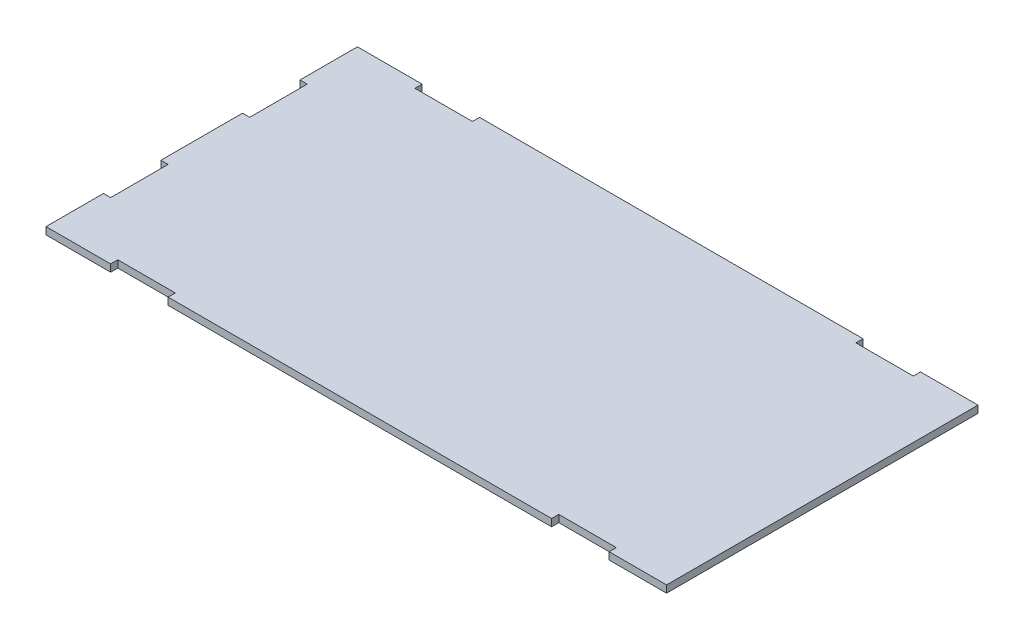
ISO-10303-21;
HEADER;
FILE_DESCRIPTION(('STEP AP214'),'2;1');
FILE_NAME('part.step','',(''),(''),'','','');
FILE_SCHEMA(('AUTOMOTIVE_DESIGN { 1 0 10303 214 1 1 1 1 }'));
ENDSEC;
DATA;
#1=APPLICATION_CONTEXT('core data for automotive mechanical design processes');
#2=APPLICATION_PROTOCOL_DEFINITION('international standard','automotive_design',2000,#1);
#3=PRODUCT_CONTEXT('',#1,'mechanical');
#4=PRODUCT('Part','Part','',(#3));
#5=PRODUCT_RELATED_PRODUCT_CATEGORY('part','',(#4));
#6=PRODUCT_DEFINITION_FORMATION('','',#4);
#7=PRODUCT_DEFINITION_CONTEXT('part definition',#1,'design');
#8=PRODUCT_DEFINITION('design','',#6,#7);
#9=PRODUCT_DEFINITION_SHAPE('','',#8);
#10=(LENGTH_UNIT() NAMED_UNIT(*) SI_UNIT(.MILLI.,.METRE.));
#11=(NAMED_UNIT(*) PLANE_ANGLE_UNIT() SI_UNIT($,.RADIAN.));
#12=(NAMED_UNIT(*) SI_UNIT($,.STERADIAN.) SOLID_ANGLE_UNIT());
#13=UNCERTAINTY_MEASURE_WITH_UNIT(LENGTH_MEASURE(1.E-05),#10,'distance_accuracy_value','');
#14=(GEOMETRIC_REPRESENTATION_CONTEXT(3) GLOBAL_UNCERTAINTY_ASSIGNED_CONTEXT((#13)) GLOBAL_UNIT_ASSIGNED_CONTEXT((#10,
#11,#12)) REPRESENTATION_CONTEXT('',''));
#15=CARTESIAN_POINT('',(0.,0.,0.));
#16=DIRECTION('',(0.,0.,1.));
#17=DIRECTION('',(1.,0.,0.));
#18=AXIS2_PLACEMENT_3D('',#15,#16,#17);
#19=CARTESIAN_POINT('',(-137.16,3.175,-68.834));
#20=DIRECTION('',(1.,0.,0.));
#21=DIRECTION('',(0.,0.,-1.));
#22=AXIS2_PLACEMENT_3D('',#19,#20,#21);
#23=PLANE('',#22);
#24=DIRECTION('',(0.,0.,1.));
#25=VECTOR('',#24,1.);
#26=CARTESIAN_POINT('',(-137.16,0.,-68.834));
#27=LINE('',#26,#25);
#28=CARTESIAN_POINT('',(-137.16,0.,-68.834));
#29=VERTEX_POINT('',#28);
#30=CARTESIAN_POINT('',(-137.16,0.,-43.434));
#31=VERTEX_POINT('',#30);
#32=EDGE_CURVE('E249',#29,#31,#27,.T.);
#33=ORIENTED_EDGE('',*,*,#32,.T.);
#34=DIRECTION('',(0.,-1.,0.));
#35=VECTOR('',#34,1.);
#36=CARTESIAN_POINT('',(-137.16,3.175,-43.434));
#37=LINE('',#36,#35);
#38=CARTESIAN_POINT('',(-137.16,3.175,-43.434));
#39=VERTEX_POINT('',#38);
#40=EDGE_CURVE('E11',#39,#31,#37,.T.);
#41=ORIENTED_EDGE('',*,*,#40,.F.);
#42=DIRECTION('',(0.,0.,1.));
#43=VECTOR('',#42,1.);
#44=CARTESIAN_POINT('',(-137.16,3.175,-68.834));
#45=LINE('',#44,#43);
#46=CARTESIAN_POINT('',(-137.16,3.175,-68.834));
#47=VERTEX_POINT('',#46);
#48=EDGE_CURVE('E303',#47,#39,#45,.T.);
#49=ORIENTED_EDGE('',*,*,#48,.F.);
#50=DIRECTION('',(0.,-1.,0.));
#51=VECTOR('',#50,1.);
#52=CARTESIAN_POINT('',(-137.16,3.175,-68.834));
#53=LINE('',#52,#51);
#54=EDGE_CURVE('E245',#47,#29,#53,.T.);
#55=ORIENTED_EDGE('',*,*,#54,.T.);
#56=EDGE_LOOP('',(#33,#41,#49,#55));
#57=FACE_BOUND('',#56,.T.);
#58=ADVANCED_FACE('F33',(#57),#23,.F.);
#59=CARTESIAN_POINT('',(-137.16,3.175,-43.434));
#60=DIRECTION('',(0.,0.,-1.));
#61=DIRECTION('',(-1.,0.,0.));
#62=AXIS2_PLACEMENT_3D('',#59,#60,#61);
#63=PLANE('',#62);
#64=DIRECTION('',(1.,0.,0.));
#65=VECTOR('',#64,1.);
#66=CARTESIAN_POINT('',(-137.16,0.,-43.434));
#67=LINE('',#66,#65);
#68=CARTESIAN_POINT('',(-133.985,0.,-43.434));
#69=VERTEX_POINT('',#68);
#70=EDGE_CURVE('E252',#31,#69,#67,.T.);
#71=ORIENTED_EDGE('',*,*,#70,.T.);
#72=DIRECTION('',(0.,-1.,0.));
#73=VECTOR('',#72,1.);
#74=CARTESIAN_POINT('',(-133.985,3.175,-43.434));
#75=LINE('',#74,#73);
#76=CARTESIAN_POINT('',(-133.985,3.175,-43.434));
#77=VERTEX_POINT('',#76);
#78=EDGE_CURVE('E41',#77,#69,#75,.T.);
#79=ORIENTED_EDGE('',*,*,#78,.F.);
#80=DIRECTION('',(1.,0.,0.));
#81=VECTOR('',#80,1.);
#82=CARTESIAN_POINT('',(-137.16,3.175,-43.434));
#83=LINE('',#82,#81);
#84=EDGE_CURVE('E152',#39,#77,#83,.T.);
#85=ORIENTED_EDGE('',*,*,#84,.F.);
#86=ORIENTED_EDGE('',*,*,#40,.T.);
#87=EDGE_LOOP('',(#71,#79,#85,#86));
#88=FACE_BOUND('',#87,.T.);
#89=ADVANCED_FACE('F461',(#88),#63,.F.);
#90=CARTESIAN_POINT('',(-133.985,3.175,-43.434));
#91=DIRECTION('',(1.,0.,0.));
#92=DIRECTION('',(0.,0.,-1.));
#93=AXIS2_PLACEMENT_3D('',#90,#91,#92);
#94=PLANE('',#93);
#95=DIRECTION('',(0.,0.,1.));
#96=VECTOR('',#95,1.);
#97=CARTESIAN_POINT('',(-133.985,0.,-43.434));
#98=LINE('',#97,#96);
#99=CARTESIAN_POINT('',(-133.985,0.,-18.034));
#100=VERTEX_POINT('',#99);
#101=EDGE_CURVE('E254',#69,#100,#98,.T.);
#102=ORIENTED_EDGE('',*,*,#101,.T.);
#103=DIRECTION('',(0.,-1.,0.));
#104=VECTOR('',#103,1.);
#105=CARTESIAN_POINT('',(-133.985,3.175,-18.034));
#106=LINE('',#105,#104);
#107=CARTESIAN_POINT('',(-133.985,3.175,-18.034));
#108=VERTEX_POINT('',#107);
#109=EDGE_CURVE('E370',#108,#100,#106,.T.);
#110=ORIENTED_EDGE('',*,*,#109,.F.);
#111=DIRECTION('',(0.,0.,1.));
#112=VECTOR('',#111,1.);
#113=CARTESIAN_POINT('',(-133.985,3.175,-43.434));
#114=LINE('',#113,#112);
#115=EDGE_CURVE('E378',#77,#108,#114,.T.);
#116=ORIENTED_EDGE('',*,*,#115,.F.);
#117=ORIENTED_EDGE('',*,*,#78,.T.);
#118=EDGE_LOOP('',(#102,#110,#116,#117));
#119=FACE_BOUND('',#118,.T.);
#120=ADVANCED_FACE('F376',(#119),#94,.F.);
#121=CARTESIAN_POINT('',(-133.985,3.175,-18.034));
#122=DIRECTION('',(0.,0.,1.));
#123=DIRECTION('',(1.,0.,0.));
#124=AXIS2_PLACEMENT_3D('',#121,#122,#123);
#125=PLANE('',#124);
#126=DIRECTION('',(-1.,0.,0.));
#127=VECTOR('',#126,1.);
#128=CARTESIAN_POINT('',(-133.985,0.,-18.034));
#129=LINE('',#128,#127);
#130=CARTESIAN_POINT('',(-137.16,0.,-18.034));
#131=VERTEX_POINT('',#130);
#132=EDGE_CURVE('E256',#100,#131,#129,.T.);
#133=ORIENTED_EDGE('',*,*,#132,.T.);
#134=DIRECTION('',(0.,-1.,0.));
#135=VECTOR('',#134,1.);
#136=CARTESIAN_POINT('',(-137.16,3.175,-18.034));
#137=LINE('',#136,#135);
#138=CARTESIAN_POINT('',(-137.16,3.175,-18.034));
#139=VERTEX_POINT('',#138);
#140=EDGE_CURVE('E367',#139,#131,#137,.T.);
#141=ORIENTED_EDGE('',*,*,#140,.F.);
#142=DIRECTION('',(-1.,0.,0.));
#143=VECTOR('',#142,1.);
#144=CARTESIAN_POINT('',(-133.985,3.175,-18.034));
#145=LINE('',#144,#143);
#146=EDGE_CURVE('E396',#108,#139,#145,.T.);
#147=ORIENTED_EDGE('',*,*,#146,.F.);
#148=ORIENTED_EDGE('',*,*,#109,.T.);
#149=EDGE_LOOP('',(#133,#141,#147,#148));
#150=FACE_BOUND('',#149,.T.);
#151=ADVANCED_FACE('F387',(#150),#125,.F.);
#152=CARTESIAN_POINT('',(-137.16,3.175,-18.034));
#153=DIRECTION('',(1.,0.,0.));
#154=DIRECTION('',(0.,0.,-1.));
#155=AXIS2_PLACEMENT_3D('',#152,#153,#154);
#156=PLANE('',#155);
#157=DIRECTION('',(0.,0.,1.));
#158=VECTOR('',#157,1.);
#159=CARTESIAN_POINT('',(-137.16,0.,-18.034));
#160=LINE('',#159,#158);
#161=CARTESIAN_POINT('',(-137.16,0.,18.034));
#162=VERTEX_POINT('',#161);
#163=EDGE_CURVE('E258',#131,#162,#160,.T.);
#164=ORIENTED_EDGE('',*,*,#163,.T.);
#165=DIRECTION('',(0.,-1.,0.));
#166=VECTOR('',#165,1.);
#167=CARTESIAN_POINT('',(-137.16,3.175,18.034));
#168=LINE('',#167,#166);
#169=CARTESIAN_POINT('',(-137.16,3.175,18.034));
#170=VERTEX_POINT('',#169);
#171=EDGE_CURVE('E364',#170,#162,#168,.T.);
#172=ORIENTED_EDGE('',*,*,#171,.F.);
#173=DIRECTION('',(0.,0.,1.));
#174=VECTOR('',#173,1.);
#175=CARTESIAN_POINT('',(-137.16,3.175,-18.034));
#176=LINE('',#175,#174);
#177=EDGE_CURVE('E393',#139,#170,#176,.T.);
#178=ORIENTED_EDGE('',*,*,#177,.F.);
#179=ORIENTED_EDGE('',*,*,#140,.T.);
#180=EDGE_LOOP('',(#164,#172,#178,#179));
#181=FACE_BOUND('',#180,.T.);
#182=ADVANCED_FACE('F391',(#181),#156,.F.);
#183=CARTESIAN_POINT('',(-133.985,3.175,18.034));
#184=DIRECTION('',(0.,0.,-1.));
#185=DIRECTION('',(-1.,0.,0.));
#186=AXIS2_PLACEMENT_3D('',#183,#184,#185);
#187=PLANE('',#186);
#188=DIRECTION('',(1.,0.,0.));
#189=VECTOR('',#188,1.);
#190=CARTESIAN_POINT('',(-133.985,0.,18.034));
#191=LINE('',#190,#189);
#192=CARTESIAN_POINT('',(-133.985,0.,18.034));
#193=VERTEX_POINT('',#192);
#194=EDGE_CURVE('E260',#162,#193,#191,.T.);
#195=ORIENTED_EDGE('',*,*,#194,.T.);
#196=DIRECTION('',(0.,-1.,0.));
#197=VECTOR('',#196,1.);
#198=CARTESIAN_POINT('',(-133.985,3.175,18.034));
#199=LINE('',#198,#197);
#200=CARTESIAN_POINT('',(-133.985,3.175,18.034));
#201=VERTEX_POINT('',#200);
#202=EDGE_CURVE('E361',#201,#193,#199,.T.);
#203=ORIENTED_EDGE('',*,*,#202,.F.);
#204=DIRECTION('',(1.,0.,0.));
#205=VECTOR('',#204,1.);
#206=CARTESIAN_POINT('',(-133.985,3.175,18.034));
#207=LINE('',#206,#205);
#208=EDGE_CURVE('E395',#170,#201,#207,.T.);
#209=ORIENTED_EDGE('',*,*,#208,.F.);
#210=ORIENTED_EDGE('',*,*,#171,.T.);
#211=EDGE_LOOP('',(#195,#203,#209,#210));
#212=FACE_BOUND('',#211,.T.);
#213=ADVANCED_FACE('F474',(#212),#187,.F.);
#214=CARTESIAN_POINT('',(-133.985,3.175,43.434));
#215=DIRECTION('',(1.,0.,0.));
#216=DIRECTION('',(0.,0.,-1.));
#217=AXIS2_PLACEMENT_3D('',#214,#215,#216);
#218=PLANE('',#217);
#219=DIRECTION('',(0.,0.,1.));
#220=VECTOR('',#219,1.);
#221=CARTESIAN_POINT('',(-133.985,0.,43.434));
#222=LINE('',#221,#220);
#223=CARTESIAN_POINT('',(-133.985,0.,43.434));
#224=VERTEX_POINT('',#223);
#225=EDGE_CURVE('E262',#193,#224,#222,.T.);
#226=ORIENTED_EDGE('',*,*,#225,.T.);
#227=DIRECTION('',(0.,-1.,0.));
#228=VECTOR('',#227,1.);
#229=CARTESIAN_POINT('',(-133.985,3.175,43.434));
#230=LINE('',#229,#228);
#231=CARTESIAN_POINT('',(-133.985,3.175,43.434));
#232=VERTEX_POINT('',#231);
#233=EDGE_CURVE('E358',#232,#224,#230,.T.);
#234=ORIENTED_EDGE('',*,*,#233,.F.);
#235=DIRECTION('',(0.,0.,1.));
#236=VECTOR('',#235,1.);
#237=CARTESIAN_POINT('',(-133.985,3.175,43.434));
#238=LINE('',#237,#236);
#239=EDGE_CURVE('E398',#201,#232,#238,.T.);
#240=ORIENTED_EDGE('',*,*,#239,.F.);
#241=ORIENTED_EDGE('',*,*,#202,.T.);
#242=EDGE_LOOP('',(#226,#234,#240,#241));
#243=FACE_BOUND('',#242,.T.);
#244=ADVANCED_FACE('F477',(#243),#218,.F.);
#245=CARTESIAN_POINT('',(-137.16,3.175,43.434));
#246=DIRECTION('',(0.,0.,1.));
#247=DIRECTION('',(1.,0.,0.));
#248=AXIS2_PLACEMENT_3D('',#245,#246,#247);
#249=PLANE('',#248);
#250=DIRECTION('',(-1.,0.,0.));
#251=VECTOR('',#250,1.);
#252=CARTESIAN_POINT('',(-137.16,0.,43.434));
#253=LINE('',#252,#251);
#254=CARTESIAN_POINT('',(-137.16,0.,43.434));
#255=VERTEX_POINT('',#254);
#256=EDGE_CURVE('E264',#224,#255,#253,.T.);
#257=ORIENTED_EDGE('',*,*,#256,.T.);
#258=DIRECTION('',(0.,-1.,0.));
#259=VECTOR('',#258,1.);
#260=CARTESIAN_POINT('',(-137.16,3.175,43.434));
#261=LINE('',#260,#259);
#262=CARTESIAN_POINT('',(-137.16,3.175,43.434));
#263=VERTEX_POINT('',#262);
#264=EDGE_CURVE('E355',#263,#255,#261,.T.);
#265=ORIENTED_EDGE('',*,*,#264,.F.);
#266=DIRECTION('',(-1.,0.,0.));
#267=VECTOR('',#266,1.);
#268=CARTESIAN_POINT('',(-137.16,3.175,43.434));
#269=LINE('',#268,#267);
#270=EDGE_CURVE('E404',#232,#263,#269,.T.);
#271=ORIENTED_EDGE('',*,*,#270,.F.);
#272=ORIENTED_EDGE('',*,*,#233,.T.);
#273=EDGE_LOOP('',(#257,#265,#271,#272));
#274=FACE_BOUND('',#273,.T.);
#275=ADVANCED_FACE('F481',(#274),#249,.F.);
#276=CARTESIAN_POINT('',(-137.16,3.175,43.434));
#277=DIRECTION('',(1.,0.,0.));
#278=DIRECTION('',(0.,0.,-1.));
#279=AXIS2_PLACEMENT_3D('',#276,#277,#278);
#280=PLANE('',#279);
#281=DIRECTION('',(0.,0.,1.));
#282=VECTOR('',#281,1.);
#283=CARTESIAN_POINT('',(-137.16,0.,43.434));
#284=LINE('',#283,#282);
#285=CARTESIAN_POINT('',(-137.16,0.,68.834));
#286=VERTEX_POINT('',#285);
#287=EDGE_CURVE('E266',#255,#286,#284,.T.);
#288=ORIENTED_EDGE('',*,*,#287,.T.);
#289=DIRECTION('',(0.,-1.,0.));
#290=VECTOR('',#289,1.);
#291=CARTESIAN_POINT('',(-137.16,3.175,68.834));
#292=LINE('',#291,#290);
#293=CARTESIAN_POINT('',(-137.16,3.175,68.834));
#294=VERTEX_POINT('',#293);
#295=EDGE_CURVE('E352',#294,#286,#292,.T.);
#296=ORIENTED_EDGE('',*,*,#295,.F.);
#297=DIRECTION('',(0.,0.,1.));
#298=VECTOR('',#297,1.);
#299=CARTESIAN_POINT('',(-137.16,3.175,43.434));
#300=LINE('',#299,#298);
#301=EDGE_CURVE('E406',#263,#294,#300,.T.);
#302=ORIENTED_EDGE('',*,*,#301,.F.);
#303=ORIENTED_EDGE('',*,*,#264,.T.);
#304=EDGE_LOOP('',(#288,#296,#302,#303));
#305=FACE_BOUND('',#304,.T.);
#306=ADVANCED_FACE('F485',(#305),#280,.F.);
#307=CARTESIAN_POINT('',(-137.16,3.175,68.834));
#308=DIRECTION('',(0.,0.,-1.));
#309=DIRECTION('',(-1.,0.,0.));
#310=AXIS2_PLACEMENT_3D('',#307,#308,#309);
#311=PLANE('',#310);
#312=DIRECTION('',(1.,0.,0.));
#313=VECTOR('',#312,1.);
#314=CARTESIAN_POINT('',(-137.16,0.,68.834));
#315=LINE('',#314,#313);
#316=CARTESIAN_POINT('',(-108.585,0.,68.834));
#317=VERTEX_POINT('',#316);
#318=EDGE_CURVE('E268',#286,#317,#315,.T.);
#319=ORIENTED_EDGE('',*,*,#318,.T.);
#320=DIRECTION('',(0.,-1.,0.));
#321=VECTOR('',#320,1.);
#322=CARTESIAN_POINT('',(-108.585,3.175,68.834));
#323=LINE('',#322,#321);
#324=CARTESIAN_POINT('',(-108.585,3.175,68.834));
#325=VERTEX_POINT('',#324);
#326=EDGE_CURVE('E349',#325,#317,#323,.T.);
#327=ORIENTED_EDGE('',*,*,#326,.F.);
#328=DIRECTION('',(1.,0.,0.));
#329=VECTOR('',#328,1.);
#330=CARTESIAN_POINT('',(-137.16,3.175,68.834));
#331=LINE('',#330,#329);
#332=EDGE_CURVE('E408',#294,#325,#331,.T.);
#333=ORIENTED_EDGE('',*,*,#332,.F.);
#334=ORIENTED_EDGE('',*,*,#295,.T.);
#335=EDGE_LOOP('',(#319,#327,#333,#334));
#336=FACE_BOUND('',#335,.T.);
#337=ADVANCED_FACE('F489',(#336),#311,.F.);
#338=CARTESIAN_POINT('',(-108.585,3.175,68.834));
#339=DIRECTION('',(-1.,0.,0.));
#340=DIRECTION('',(0.,0.,1.));
#341=AXIS2_PLACEMENT_3D('',#338,#339,#340);
#342=PLANE('',#341);
#343=DIRECTION('',(0.,0.,-1.));
#344=VECTOR('',#343,1.);
#345=CARTESIAN_POINT('',(-108.585,0.,68.834));
#346=LINE('',#345,#344);
#347=CARTESIAN_POINT('',(-108.585,0.,65.659));
#348=VERTEX_POINT('',#347);
#349=EDGE_CURVE('E270',#317,#348,#346,.T.);
#350=ORIENTED_EDGE('',*,*,#349,.T.);
#351=DIRECTION('',(0.,-1.,0.));
#352=VECTOR('',#351,1.);
#353=CARTESIAN_POINT('',(-108.585,3.175,65.659));
#354=LINE('',#353,#352);
#355=CARTESIAN_POINT('',(-108.585,3.175,65.659));
#356=VERTEX_POINT('',#355);
#357=EDGE_CURVE('E346',#356,#348,#354,.T.);
#358=ORIENTED_EDGE('',*,*,#357,.F.);
#359=DIRECTION('',(0.,0.,-1.));
#360=VECTOR('',#359,1.);
#361=CARTESIAN_POINT('',(-108.585,3.175,68.834));
#362=LINE('',#361,#360);
#363=EDGE_CURVE('E410',#325,#356,#362,.T.);
#364=ORIENTED_EDGE('',*,*,#363,.F.);
#365=ORIENTED_EDGE('',*,*,#326,.T.);
#366=EDGE_LOOP('',(#350,#358,#364,#365));
#367=FACE_BOUND('',#366,.T.);
#368=ADVANCED_FACE('F493',(#367),#342,.F.);
#369=CARTESIAN_POINT('',(-108.585,3.175,65.659));
#370=DIRECTION('',(0.,0.,-1.));
#371=DIRECTION('',(-1.,0.,0.));
#372=AXIS2_PLACEMENT_3D('',#369,#370,#371);
#373=PLANE('',#372);
#374=DIRECTION('',(1.,0.,0.));
#375=VECTOR('',#374,1.);
#376=CARTESIAN_POINT('',(-108.585,0.,65.659));
#377=LINE('',#376,#375);
#378=CARTESIAN_POINT('',(-83.185,0.,65.659));
#379=VERTEX_POINT('',#378);
#380=EDGE_CURVE('E272',#348,#379,#377,.T.);
#381=ORIENTED_EDGE('',*,*,#380,.T.);
#382=DIRECTION('',(0.,-1.,0.));
#383=VECTOR('',#382,1.);
#384=CARTESIAN_POINT('',(-83.185,3.175,65.659));
#385=LINE('',#384,#383);
#386=CARTESIAN_POINT('',(-83.185,3.175,65.659));
#387=VERTEX_POINT('',#386);
#388=EDGE_CURVE('E343',#387,#379,#385,.T.);
#389=ORIENTED_EDGE('',*,*,#388,.F.);
#390=DIRECTION('',(1.,0.,0.));
#391=VECTOR('',#390,1.);
#392=CARTESIAN_POINT('',(-108.585,3.175,65.659));
#393=LINE('',#392,#391);
#394=EDGE_CURVE('E412',#356,#387,#393,.T.);
#395=ORIENTED_EDGE('',*,*,#394,.F.);
#396=ORIENTED_EDGE('',*,*,#357,.T.);
#397=EDGE_LOOP('',(#381,#389,#395,#396));
#398=FACE_BOUND('',#397,.T.);
#399=ADVANCED_FACE('F497',(#398),#373,.F.);
#400=CARTESIAN_POINT('',(-83.185,3.175,65.659));
#401=DIRECTION('',(1.,0.,0.));
#402=DIRECTION('',(0.,0.,-1.));
#403=AXIS2_PLACEMENT_3D('',#400,#401,#402);
#404=PLANE('',#403);
#405=DIRECTION('',(0.,0.,1.));
#406=VECTOR('',#405,1.);
#407=CARTESIAN_POINT('',(-83.185,0.,65.659));
#408=LINE('',#407,#406);
#409=CARTESIAN_POINT('',(-83.185,0.,68.834));
#410=VERTEX_POINT('',#409);
#411=EDGE_CURVE('E274',#379,#410,#408,.T.);
#412=ORIENTED_EDGE('',*,*,#411,.T.);
#413=DIRECTION('',(0.,-1.,0.));
#414=VECTOR('',#413,1.);
#415=CARTESIAN_POINT('',(-83.185,3.175,68.834));
#416=LINE('',#415,#414);
#417=CARTESIAN_POINT('',(-83.185,3.175,68.834));
#418=VERTEX_POINT('',#417);
#419=EDGE_CURVE('E340',#418,#410,#416,.T.);
#420=ORIENTED_EDGE('',*,*,#419,.F.);
#421=DIRECTION('',(0.,0.,1.));
#422=VECTOR('',#421,1.);
#423=CARTESIAN_POINT('',(-83.185,3.175,65.659));
#424=LINE('',#423,#422);
#425=EDGE_CURVE('E414',#387,#418,#424,.T.);
#426=ORIENTED_EDGE('',*,*,#425,.F.);
#427=ORIENTED_EDGE('',*,*,#388,.T.);
#428=EDGE_LOOP('',(#412,#420,#426,#427));
#429=FACE_BOUND('',#428,.T.);
#430=ADVANCED_FACE('F501',(#429),#404,.F.);
#431=CARTESIAN_POINT('',(-83.185,3.175,68.834));
#432=DIRECTION('',(0.,0.,-1.));
#433=DIRECTION('',(-1.,0.,0.));
#434=AXIS2_PLACEMENT_3D('',#431,#432,#433);
#435=PLANE('',#434);
#436=DIRECTION('',(1.,0.,0.));
#437=VECTOR('',#436,1.);
#438=CARTESIAN_POINT('',(-83.185,0.,68.834));
#439=LINE('',#438,#437);
#440=CARTESIAN_POINT('',(86.36,0.,68.834));
#441=VERTEX_POINT('',#440);
#442=EDGE_CURVE('E276',#410,#441,#439,.T.);
#443=ORIENTED_EDGE('',*,*,#442,.T.);
#444=DIRECTION('',(0.,-1.,0.));
#445=VECTOR('',#444,1.);
#446=CARTESIAN_POINT('',(86.36,3.175,68.834));
#447=LINE('',#446,#445);
#448=CARTESIAN_POINT('',(86.36,3.175,68.834));
#449=VERTEX_POINT('',#448);
#450=EDGE_CURVE('E337',#449,#441,#447,.T.);
#451=ORIENTED_EDGE('',*,*,#450,.F.);
#452=DIRECTION('',(1.,0.,0.));
#453=VECTOR('',#452,1.);
#454=CARTESIAN_POINT('',(-83.185,3.175,68.834));
#455=LINE('',#454,#453);
#456=EDGE_CURVE('E416',#418,#449,#455,.T.);
#457=ORIENTED_EDGE('',*,*,#456,.F.);
#458=ORIENTED_EDGE('',*,*,#419,.T.);
#459=EDGE_LOOP('',(#443,#451,#457,#458));
#460=FACE_BOUND('',#459,.T.);
#461=ADVANCED_FACE('F505',(#460),#435,.F.);
#462=CARTESIAN_POINT('',(86.36,3.175,68.834));
#463=DIRECTION('',(-1.,0.,0.));
#464=DIRECTION('',(0.,0.,1.));
#465=AXIS2_PLACEMENT_3D('',#462,#463,#464);
#466=PLANE('',#465);
#467=DIRECTION('',(0.,0.,-1.));
#468=VECTOR('',#467,1.);
#469=CARTESIAN_POINT('',(86.36,0.,68.834));
#470=LINE('',#469,#468);
#471=CARTESIAN_POINT('',(86.36,0.,65.659));
#472=VERTEX_POINT('',#471);
#473=EDGE_CURVE('E278',#441,#472,#470,.T.);
#474=ORIENTED_EDGE('',*,*,#473,.T.);
#475=DIRECTION('',(0.,-1.,0.));
#476=VECTOR('',#475,1.);
#477=CARTESIAN_POINT('',(86.36,3.175,65.659));
#478=LINE('',#477,#476);
#479=CARTESIAN_POINT('',(86.36,3.175,65.659));
#480=VERTEX_POINT('',#479);
#481=EDGE_CURVE('E334',#480,#472,#478,.T.);
#482=ORIENTED_EDGE('',*,*,#481,.F.);
#483=DIRECTION('',(0.,0.,-1.));
#484=VECTOR('',#483,1.);
#485=CARTESIAN_POINT('',(86.36,3.175,68.834));
#486=LINE('',#485,#484);
#487=EDGE_CURVE('E418',#449,#480,#486,.T.);
#488=ORIENTED_EDGE('',*,*,#487,.F.);
#489=ORIENTED_EDGE('',*,*,#450,.T.);
#490=EDGE_LOOP('',(#474,#482,#488,#489));
#491=FACE_BOUND('',#490,.T.);
#492=ADVANCED_FACE('F509',(#491),#466,.F.);
#493=CARTESIAN_POINT('',(86.36,3.175,65.659));
#494=DIRECTION('',(0.,0.,-1.));
#495=DIRECTION('',(-1.,0.,0.));
#496=AXIS2_PLACEMENT_3D('',#493,#494,#495);
#497=PLANE('',#496);
#498=DIRECTION('',(1.,0.,0.));
#499=VECTOR('',#498,1.);
#500=CARTESIAN_POINT('',(86.36,0.,65.659));
#501=LINE('',#500,#499);
#502=CARTESIAN_POINT('',(111.76,0.,65.659));
#503=VERTEX_POINT('',#502);
#504=EDGE_CURVE('E280',#472,#503,#501,.T.);
#505=ORIENTED_EDGE('',*,*,#504,.T.);
#506=DIRECTION('',(0.,-1.,0.));
#507=VECTOR('',#506,1.);
#508=CARTESIAN_POINT('',(111.76,3.175,65.659));
#509=LINE('',#508,#507);
#510=CARTESIAN_POINT('',(111.76,3.175,65.659));
#511=VERTEX_POINT('',#510);
#512=EDGE_CURVE('E331',#511,#503,#509,.T.);
#513=ORIENTED_EDGE('',*,*,#512,.F.);
#514=DIRECTION('',(1.,0.,0.));
#515=VECTOR('',#514,1.);
#516=CARTESIAN_POINT('',(86.36,3.175,65.659));
#517=LINE('',#516,#515);
#518=EDGE_CURVE('E420',#480,#511,#517,.T.);
#519=ORIENTED_EDGE('',*,*,#518,.F.);
#520=ORIENTED_EDGE('',*,*,#481,.T.);
#521=EDGE_LOOP('',(#505,#513,#519,#520));
#522=FACE_BOUND('',#521,.T.);
#523=ADVANCED_FACE('F513',(#522),#497,.F.);
#524=CARTESIAN_POINT('',(111.76,3.175,65.659));
#525=DIRECTION('',(1.,0.,0.));
#526=DIRECTION('',(0.,0.,-1.));
#527=AXIS2_PLACEMENT_3D('',#524,#525,#526);
#528=PLANE('',#527);
#529=DIRECTION('',(0.,0.,1.));
#530=VECTOR('',#529,1.);
#531=CARTESIAN_POINT('',(111.76,0.,65.659));
#532=LINE('',#531,#530);
#533=CARTESIAN_POINT('',(111.76,0.,68.834));
#534=VERTEX_POINT('',#533);
#535=EDGE_CURVE('E282',#503,#534,#532,.T.);
#536=ORIENTED_EDGE('',*,*,#535,.T.);
#537=DIRECTION('',(0.,-1.,0.));
#538=VECTOR('',#537,1.);
#539=CARTESIAN_POINT('',(111.76,3.175,68.834));
#540=LINE('',#539,#538);
#541=CARTESIAN_POINT('',(111.76,3.175,68.834));
#542=VERTEX_POINT('',#541);
#543=EDGE_CURVE('E328',#542,#534,#540,.T.);
#544=ORIENTED_EDGE('',*,*,#543,.F.);
#545=DIRECTION('',(0.,0.,1.));
#546=VECTOR('',#545,1.);
#547=CARTESIAN_POINT('',(111.76,3.175,65.659));
#548=LINE('',#547,#546);
#549=EDGE_CURVE('E422',#511,#542,#548,.T.);
#550=ORIENTED_EDGE('',*,*,#549,.F.);
#551=ORIENTED_EDGE('',*,*,#512,.T.);
#552=EDGE_LOOP('',(#536,#544,#550,#551));
#553=FACE_BOUND('',#552,.T.);
#554=ADVANCED_FACE('F517',(#553),#528,.F.);
#555=CARTESIAN_POINT('',(111.76,3.175,68.834));
#556=DIRECTION('',(0.,0.,-1.));
#557=DIRECTION('',(-1.,0.,0.));
#558=AXIS2_PLACEMENT_3D('',#555,#556,#557);
#559=PLANE('',#558);
#560=DIRECTION('',(1.,0.,0.));
#561=VECTOR('',#560,1.);
#562=CARTESIAN_POINT('',(111.76,0.,68.834));
#563=LINE('',#562,#561);
#564=CARTESIAN_POINT('',(137.16,0.,68.834));
#565=VERTEX_POINT('',#564);
#566=EDGE_CURVE('E284',#534,#565,#563,.T.);
#567=ORIENTED_EDGE('',*,*,#566,.T.);
#568=DIRECTION('',(0.,-1.,0.));
#569=VECTOR('',#568,1.);
#570=CARTESIAN_POINT('',(137.16,3.175,68.834));
#571=LINE('',#570,#569);
#572=CARTESIAN_POINT('',(137.16,3.175,68.834));
#573=VERTEX_POINT('',#572);
#574=EDGE_CURVE('E325',#573,#565,#571,.T.);
#575=ORIENTED_EDGE('',*,*,#574,.F.);
#576=DIRECTION('',(1.,0.,0.));
#577=VECTOR('',#576,1.);
#578=CARTESIAN_POINT('',(111.76,3.175,68.834));
#579=LINE('',#578,#577);
#580=EDGE_CURVE('E424',#542,#573,#579,.T.);
#581=ORIENTED_EDGE('',*,*,#580,.F.);
#582=ORIENTED_EDGE('',*,*,#543,.T.);
#583=EDGE_LOOP('',(#567,#575,#581,#582));
#584=FACE_BOUND('',#583,.T.);
#585=ADVANCED_FACE('F521',(#584),#559,.F.);
#586=CARTESIAN_POINT('',(137.16,3.175,-68.834));
#587=DIRECTION('',(-1.,0.,0.));
#588=DIRECTION('',(0.,0.,1.));
#589=AXIS2_PLACEMENT_3D('',#586,#587,#588);
#590=PLANE('',#589);
#591=DIRECTION('',(0.,0.,-1.));
#592=VECTOR('',#591,1.);
#593=CARTESIAN_POINT('',(137.16,0.,-68.834));
#594=LINE('',#593,#592);
#595=CARTESIAN_POINT('',(137.16,0.,-68.834));
#596=VERTEX_POINT('',#595);
#597=EDGE_CURVE('E286',#565,#596,#594,.T.);
#598=ORIENTED_EDGE('',*,*,#597,.T.);
#599=DIRECTION('',(0.,-1.,0.));
#600=VECTOR('',#599,1.);
#601=CARTESIAN_POINT('',(137.16,3.175,-68.834));
#602=LINE('',#601,#600);
#603=CARTESIAN_POINT('',(137.16,3.175,-68.834));
#604=VERTEX_POINT('',#603);
#605=EDGE_CURVE('E322',#604,#596,#602,.T.);
#606=ORIENTED_EDGE('',*,*,#605,.F.);
#607=DIRECTION('',(0.,0.,-1.));
#608=VECTOR('',#607,1.);
#609=CARTESIAN_POINT('',(137.16,3.175,-68.834));
#610=LINE('',#609,#608);
#611=EDGE_CURVE('E426',#573,#604,#610,.T.);
#612=ORIENTED_EDGE('',*,*,#611,.F.);
#613=ORIENTED_EDGE('',*,*,#574,.T.);
#614=EDGE_LOOP('',(#598,#606,#612,#613));
#615=FACE_BOUND('',#614,.T.);
#616=ADVANCED_FACE('F525',(#615),#590,.F.);
#617=CARTESIAN_POINT('',(111.76,3.175,-68.834));
#618=DIRECTION('',(0.,0.,1.));
#619=DIRECTION('',(1.,0.,0.));
#620=AXIS2_PLACEMENT_3D('',#617,#618,#619);
#621=PLANE('',#620);
#622=DIRECTION('',(-1.,0.,0.));
#623=VECTOR('',#622,1.);
#624=CARTESIAN_POINT('',(111.76,0.,-68.834));
#625=LINE('',#624,#623);
#626=CARTESIAN_POINT('',(111.76,0.,-68.834));
#627=VERTEX_POINT('',#626);
#628=EDGE_CURVE('E288',#596,#627,#625,.T.);
#629=ORIENTED_EDGE('',*,*,#628,.T.);
#630=DIRECTION('',(0.,-1.,0.));
#631=VECTOR('',#630,1.);
#632=CARTESIAN_POINT('',(111.76,3.175,-68.834));
#633=LINE('',#632,#631);
#634=CARTESIAN_POINT('',(111.76,3.175,-68.834));
#635=VERTEX_POINT('',#634);
#636=EDGE_CURVE('E319',#635,#627,#633,.T.);
#637=ORIENTED_EDGE('',*,*,#636,.F.);
#638=DIRECTION('',(-1.,0.,0.));
#639=VECTOR('',#638,1.);
#640=CARTESIAN_POINT('',(111.76,3.175,-68.834));
#641=LINE('',#640,#639);
#642=EDGE_CURVE('E428',#604,#635,#641,.T.);
#643=ORIENTED_EDGE('',*,*,#642,.F.);
#644=ORIENTED_EDGE('',*,*,#605,.T.);
#645=EDGE_LOOP('',(#629,#637,#643,#644));
#646=FACE_BOUND('',#645,.T.);
#647=ADVANCED_FACE('F529',(#646),#621,.F.);
#648=CARTESIAN_POINT('',(111.76,3.175,-65.659));
#649=DIRECTION('',(1.,0.,0.));
#650=DIRECTION('',(0.,0.,-1.));
#651=AXIS2_PLACEMENT_3D('',#648,#649,#650);
#652=PLANE('',#651);
#653=DIRECTION('',(0.,0.,1.));
#654=VECTOR('',#653,1.);
#655=CARTESIAN_POINT('',(111.76,0.,-65.659));
#656=LINE('',#655,#654);
#657=CARTESIAN_POINT('',(111.76,0.,-65.659));
#658=VERTEX_POINT('',#657);
#659=EDGE_CURVE('E290',#627,#658,#656,.T.);
#660=ORIENTED_EDGE('',*,*,#659,.T.);
#661=DIRECTION('',(0.,-1.,0.));
#662=VECTOR('',#661,1.);
#663=CARTESIAN_POINT('',(111.76,3.175,-65.659));
#664=LINE('',#663,#662);
#665=CARTESIAN_POINT('',(111.76,3.175,-65.659));
#666=VERTEX_POINT('',#665);
#667=EDGE_CURVE('E316',#666,#658,#664,.T.);
#668=ORIENTED_EDGE('',*,*,#667,.F.);
#669=DIRECTION('',(0.,0.,1.));
#670=VECTOR('',#669,1.);
#671=CARTESIAN_POINT('',(111.76,3.175,-65.659));
#672=LINE('',#671,#670);
#673=EDGE_CURVE('E430',#635,#666,#672,.T.);
#674=ORIENTED_EDGE('',*,*,#673,.F.);
#675=ORIENTED_EDGE('',*,*,#636,.T.);
#676=EDGE_LOOP('',(#660,#668,#674,#675));
#677=FACE_BOUND('',#676,.T.);
#678=ADVANCED_FACE('F533',(#677),#652,.F.);
#679=CARTESIAN_POINT('',(86.36,3.175,-65.659));
#680=DIRECTION('',(0.,0.,1.));
#681=DIRECTION('',(1.,0.,0.));
#682=AXIS2_PLACEMENT_3D('',#679,#680,#681);
#683=PLANE('',#682);
#684=DIRECTION('',(-1.,0.,0.));
#685=VECTOR('',#684,1.);
#686=CARTESIAN_POINT('',(86.36,0.,-65.659));
#687=LINE('',#686,#685);
#688=CARTESIAN_POINT('',(86.36,0.,-65.659));
#689=VERTEX_POINT('',#688);
#690=EDGE_CURVE('E292',#658,#689,#687,.T.);
#691=ORIENTED_EDGE('',*,*,#690,.T.);
#692=DIRECTION('',(0.,-1.,0.));
#693=VECTOR('',#692,1.);
#694=CARTESIAN_POINT('',(86.36,3.175,-65.659));
#695=LINE('',#694,#693);
#696=CARTESIAN_POINT('',(86.36,3.175,-65.659));
#697=VERTEX_POINT('',#696);
#698=EDGE_CURVE('E313',#697,#689,#695,.T.);
#699=ORIENTED_EDGE('',*,*,#698,.F.);
#700=DIRECTION('',(-1.,0.,0.));
#701=VECTOR('',#700,1.);
#702=CARTESIAN_POINT('',(86.36,3.175,-65.659));
#703=LINE('',#702,#701);
#704=EDGE_CURVE('E432',#666,#697,#703,.T.);
#705=ORIENTED_EDGE('',*,*,#704,.F.);
#706=ORIENTED_EDGE('',*,*,#667,.T.);
#707=EDGE_LOOP('',(#691,#699,#705,#706));
#708=FACE_BOUND('',#707,.T.);
#709=ADVANCED_FACE('F537',(#708),#683,.F.);
#710=CARTESIAN_POINT('',(86.36,3.175,-68.834));
#711=DIRECTION('',(-1.,0.,0.));
#712=DIRECTION('',(0.,0.,1.));
#713=AXIS2_PLACEMENT_3D('',#710,#711,#712);
#714=PLANE('',#713);
#715=DIRECTION('',(0.,0.,-1.));
#716=VECTOR('',#715,1.);
#717=CARTESIAN_POINT('',(86.36,0.,-68.834));
#718=LINE('',#717,#716);
#719=CARTESIAN_POINT('',(86.36,0.,-68.834));
#720=VERTEX_POINT('',#719);
#721=EDGE_CURVE('E294',#689,#720,#718,.T.);
#722=ORIENTED_EDGE('',*,*,#721,.T.);
#723=DIRECTION('',(0.,-1.,0.));
#724=VECTOR('',#723,1.);
#725=CARTESIAN_POINT('',(86.36,3.175,-68.834));
#726=LINE('',#725,#724);
#727=CARTESIAN_POINT('',(86.36,3.175,-68.834));
#728=VERTEX_POINT('',#727);
#729=EDGE_CURVE('E310',#728,#720,#726,.T.);
#730=ORIENTED_EDGE('',*,*,#729,.F.);
#731=DIRECTION('',(0.,0.,-1.));
#732=VECTOR('',#731,1.);
#733=CARTESIAN_POINT('',(86.36,3.175,-68.834));
#734=LINE('',#733,#732);
#735=EDGE_CURVE('E434',#697,#728,#734,.T.);
#736=ORIENTED_EDGE('',*,*,#735,.F.);
#737=ORIENTED_EDGE('',*,*,#698,.T.);
#738=EDGE_LOOP('',(#722,#730,#736,#737));
#739=FACE_BOUND('',#738,.T.);
#740=ADVANCED_FACE('F541',(#739),#714,.F.);
#741=CARTESIAN_POINT('',(-83.185,3.175,-68.834));
#742=DIRECTION('',(0.,0.,1.));
#743=DIRECTION('',(1.,0.,0.));
#744=AXIS2_PLACEMENT_3D('',#741,#742,#743);
#745=PLANE('',#744);
#746=DIRECTION('',(-1.,0.,0.));
#747=VECTOR('',#746,1.);
#748=CARTESIAN_POINT('',(-83.185,0.,-68.834));
#749=LINE('',#748,#747);
#750=CARTESIAN_POINT('',(-83.185,0.,-68.834));
#751=VERTEX_POINT('',#750);
#752=EDGE_CURVE('E296',#720,#751,#749,.T.);
#753=ORIENTED_EDGE('',*,*,#752,.T.);
#754=DIRECTION('',(0.,-1.,0.));
#755=VECTOR('',#754,1.);
#756=CARTESIAN_POINT('',(-83.185,3.175,-68.834));
#757=LINE('',#756,#755);
#758=CARTESIAN_POINT('',(-83.185,3.175,-68.834));
#759=VERTEX_POINT('',#758);
#760=EDGE_CURVE('E307',#759,#751,#757,.T.);
#761=ORIENTED_EDGE('',*,*,#760,.F.);
#762=DIRECTION('',(-1.,0.,0.));
#763=VECTOR('',#762,1.);
#764=CARTESIAN_POINT('',(-83.185,3.175,-68.834));
#765=LINE('',#764,#763);
#766=EDGE_CURVE('E436',#728,#759,#765,.T.);
#767=ORIENTED_EDGE('',*,*,#766,.F.);
#768=ORIENTED_EDGE('',*,*,#729,.T.);
#769=EDGE_LOOP('',(#753,#761,#767,#768));
#770=FACE_BOUND('',#769,.T.);
#771=ADVANCED_FACE('F442',(#770),#745,.F.);
#772=CARTESIAN_POINT('',(-83.185,3.175,-65.659));
#773=DIRECTION('',(1.,0.,0.));
#774=DIRECTION('',(0.,0.,-1.));
#775=AXIS2_PLACEMENT_3D('',#772,#773,#774);
#776=PLANE('',#775);
#777=DIRECTION('',(0.,0.,1.));
#778=VECTOR('',#777,1.);
#779=CARTESIAN_POINT('',(-83.185,0.,-65.659));
#780=LINE('',#779,#778);
#781=CARTESIAN_POINT('',(-83.185,0.,-65.659));
#782=VERTEX_POINT('',#781);
#783=EDGE_CURVE('E298',#751,#782,#780,.T.);
#784=ORIENTED_EDGE('',*,*,#783,.T.);
#785=DIRECTION('',(0.,-1.,0.));
#786=VECTOR('',#785,1.);
#787=CARTESIAN_POINT('',(-83.185,3.175,-65.659));
#788=LINE('',#787,#786);
#789=CARTESIAN_POINT('',(-83.185,3.175,-65.659));
#790=VERTEX_POINT('',#789);
#791=EDGE_CURVE('E240',#790,#782,#788,.T.);
#792=ORIENTED_EDGE('',*,*,#791,.F.);
#793=DIRECTION('',(0.,0.,1.));
#794=VECTOR('',#793,1.);
#795=CARTESIAN_POINT('',(-83.185,3.175,-65.659));
#796=LINE('',#795,#794);
#797=EDGE_CURVE('E231',#759,#790,#796,.T.);
#798=ORIENTED_EDGE('',*,*,#797,.F.);
#799=ORIENTED_EDGE('',*,*,#760,.T.);
#800=EDGE_LOOP('',(#784,#792,#798,#799));
#801=FACE_BOUND('',#800,.T.);
#802=ADVANCED_FACE('F446',(#801),#776,.F.);
#803=CARTESIAN_POINT('',(-108.585,3.175,-65.659));
#804=DIRECTION('',(0.,0.,1.));
#805=DIRECTION('',(1.,0.,0.));
#806=AXIS2_PLACEMENT_3D('',#803,#804,#805);
#807=PLANE('',#806);
#808=DIRECTION('',(-1.,0.,0.));
#809=VECTOR('',#808,1.);
#810=CARTESIAN_POINT('',(-108.585,0.,-65.659));
#811=LINE('',#810,#809);
#812=CARTESIAN_POINT('',(-108.585,0.,-65.659));
#813=VERTEX_POINT('',#812);
#814=EDGE_CURVE('E239',#782,#813,#811,.T.);
#815=ORIENTED_EDGE('',*,*,#814,.T.);
#816=DIRECTION('',(0.,-1.,0.));
#817=VECTOR('',#816,1.);
#818=CARTESIAN_POINT('',(-108.585,3.175,-65.659));
#819=LINE('',#818,#817);
#820=CARTESIAN_POINT('',(-108.585,3.175,-65.659));
#821=VERTEX_POINT('',#820);
#822=EDGE_CURVE('E236',#821,#813,#819,.T.);
#823=ORIENTED_EDGE('',*,*,#822,.F.);
#824=DIRECTION('',(-1.,0.,0.));
#825=VECTOR('',#824,1.);
#826=CARTESIAN_POINT('',(-108.585,3.175,-65.659));
#827=LINE('',#826,#825);
#828=EDGE_CURVE('E225',#790,#821,#827,.T.);
#829=ORIENTED_EDGE('',*,*,#828,.F.);
#830=ORIENTED_EDGE('',*,*,#791,.T.);
#831=EDGE_LOOP('',(#815,#823,#829,#830));
#832=FACE_BOUND('',#831,.T.);
#833=ADVANCED_FACE('F237',(#832),#807,.F.);
#834=CARTESIAN_POINT('',(-108.585,3.175,-68.834));
#835=DIRECTION('',(-1.,0.,0.));
#836=DIRECTION('',(0.,0.,1.));
#837=AXIS2_PLACEMENT_3D('',#834,#835,#836);
#838=PLANE('',#837);
#839=DIRECTION('',(0.,0.,-1.));
#840=VECTOR('',#839,1.);
#841=CARTESIAN_POINT('',(-108.585,0.,-68.834));
#842=LINE('',#841,#840);
#843=CARTESIAN_POINT('',(-108.585,0.,-68.834));
#844=VERTEX_POINT('',#843);
#845=EDGE_CURVE('E138',#813,#844,#842,.T.);
#846=ORIENTED_EDGE('',*,*,#845,.T.);
#847=DIRECTION('',(0.,-1.,0.));
#848=VECTOR('',#847,1.);
#849=CARTESIAN_POINT('',(-108.585,3.175,-68.834));
#850=LINE('',#849,#848);
#851=CARTESIAN_POINT('',(-108.585,3.175,-68.834));
#852=VERTEX_POINT('',#851);
#853=EDGE_CURVE('E241',#852,#844,#850,.T.);
#854=ORIENTED_EDGE('',*,*,#853,.F.);
#855=DIRECTION('',(0.,0.,-1.));
#856=VECTOR('',#855,1.);
#857=CARTESIAN_POINT('',(-108.585,3.175,-68.834));
#858=LINE('',#857,#856);
#859=EDGE_CURVE('E229',#821,#852,#858,.T.);
#860=ORIENTED_EDGE('',*,*,#859,.F.);
#861=ORIENTED_EDGE('',*,*,#822,.T.);
#862=EDGE_LOOP('',(#846,#854,#860,#861));
#863=FACE_BOUND('',#862,.T.);
#864=ADVANCED_FACE('F243',(#863),#838,.F.);
#865=CARTESIAN_POINT('',(-137.16,3.175,-68.834));
#866=DIRECTION('',(0.,0.,1.));
#867=DIRECTION('',(1.,0.,0.));
#868=AXIS2_PLACEMENT_3D('',#865,#866,#867);
#869=PLANE('',#868);
#870=DIRECTION('',(-1.,0.,0.));
#871=VECTOR('',#870,1.);
#872=CARTESIAN_POINT('',(-137.16,0.,-68.834));
#873=LINE('',#872,#871);
#874=EDGE_CURVE('E144',#844,#29,#873,.T.);
#875=ORIENTED_EDGE('',*,*,#874,.T.);
#876=ORIENTED_EDGE('',*,*,#54,.F.);
#877=DIRECTION('',(-1.,0.,0.));
#878=VECTOR('',#877,1.);
#879=CARTESIAN_POINT('',(-137.16,3.175,-68.834));
#880=LINE('',#879,#878);
#881=EDGE_CURVE('E49',#852,#47,#880,.T.);
#882=ORIENTED_EDGE('',*,*,#881,.F.);
#883=ORIENTED_EDGE('',*,*,#853,.T.);
#884=EDGE_LOOP('',(#875,#876,#882,#883));
#885=FACE_BOUND('',#884,.T.);
#886=ADVANCED_FACE('F450',(#885),#869,.F.);
#887=CARTESIAN_POINT('',(0.,3.175,0.));
#888=DIRECTION('',(0.,1.,0.));
#889=DIRECTION('',(0.,0.,1.));
#890=AXIS2_PLACEMENT_3D('',#887,#888,#889);
#891=PLANE('',#890);
#892=ORIENTED_EDGE('',*,*,#48,.T.);
#893=ORIENTED_EDGE('',*,*,#84,.T.);
#894=ORIENTED_EDGE('',*,*,#115,.T.);
#895=ORIENTED_EDGE('',*,*,#146,.T.);
#896=ORIENTED_EDGE('',*,*,#177,.T.);
#897=ORIENTED_EDGE('',*,*,#208,.T.);
#898=ORIENTED_EDGE('',*,*,#239,.T.);
#899=ORIENTED_EDGE('',*,*,#270,.T.);
#900=ORIENTED_EDGE('',*,*,#301,.T.);
#901=ORIENTED_EDGE('',*,*,#332,.T.);
#902=ORIENTED_EDGE('',*,*,#363,.T.);
#903=ORIENTED_EDGE('',*,*,#394,.T.);
#904=ORIENTED_EDGE('',*,*,#425,.T.);
#905=ORIENTED_EDGE('',*,*,#456,.T.);
#906=ORIENTED_EDGE('',*,*,#487,.T.);
#907=ORIENTED_EDGE('',*,*,#518,.T.);
#908=ORIENTED_EDGE('',*,*,#549,.T.);
#909=ORIENTED_EDGE('',*,*,#580,.T.);
#910=ORIENTED_EDGE('',*,*,#611,.T.);
#911=ORIENTED_EDGE('',*,*,#642,.T.);
#912=ORIENTED_EDGE('',*,*,#673,.T.);
#913=ORIENTED_EDGE('',*,*,#704,.T.);
#914=ORIENTED_EDGE('',*,*,#735,.T.);
#915=ORIENTED_EDGE('',*,*,#766,.T.);
#916=ORIENTED_EDGE('',*,*,#797,.T.);
#917=ORIENTED_EDGE('',*,*,#828,.T.);
#918=ORIENTED_EDGE('',*,*,#859,.T.);
#919=ORIENTED_EDGE('',*,*,#881,.T.);
#920=EDGE_LOOP('',(#892,#893,#894,#895,#896,#897,#898,#899,#900,#901,#902,#903,#904,#905,#906,
#907,#908,#909,#910,#911,#912,#913,#914,#915,#916,#917,#918,#919));
#921=FACE_BOUND('',#920,.T.);
#922=ADVANCED_FACE('F227',(#921),#891,.T.);
#923=CARTESIAN_POINT('',(0.,0.,0.));
#924=DIRECTION('',(0.,1.,0.));
#925=DIRECTION('',(0.,0.,1.));
#926=AXIS2_PLACEMENT_3D('',#923,#924,#925);
#927=PLANE('',#926);
#928=ORIENTED_EDGE('',*,*,#32,.F.);
#929=ORIENTED_EDGE('',*,*,#874,.F.);
#930=ORIENTED_EDGE('',*,*,#845,.F.);
#931=ORIENTED_EDGE('',*,*,#814,.F.);
#932=ORIENTED_EDGE('',*,*,#783,.F.);
#933=ORIENTED_EDGE('',*,*,#752,.F.);
#934=ORIENTED_EDGE('',*,*,#721,.F.);
#935=ORIENTED_EDGE('',*,*,#690,.F.);
#936=ORIENTED_EDGE('',*,*,#659,.F.);
#937=ORIENTED_EDGE('',*,*,#628,.F.);
#938=ORIENTED_EDGE('',*,*,#597,.F.);
#939=ORIENTED_EDGE('',*,*,#566,.F.);
#940=ORIENTED_EDGE('',*,*,#535,.F.);
#941=ORIENTED_EDGE('',*,*,#504,.F.);
#942=ORIENTED_EDGE('',*,*,#473,.F.);
#943=ORIENTED_EDGE('',*,*,#442,.F.);
#944=ORIENTED_EDGE('',*,*,#411,.F.);
#945=ORIENTED_EDGE('',*,*,#380,.F.);
#946=ORIENTED_EDGE('',*,*,#349,.F.);
#947=ORIENTED_EDGE('',*,*,#318,.F.);
#948=ORIENTED_EDGE('',*,*,#287,.F.);
#949=ORIENTED_EDGE('',*,*,#256,.F.);
#950=ORIENTED_EDGE('',*,*,#225,.F.);
#951=ORIENTED_EDGE('',*,*,#194,.F.);
#952=ORIENTED_EDGE('',*,*,#163,.F.);
#953=ORIENTED_EDGE('',*,*,#132,.F.);
#954=ORIENTED_EDGE('',*,*,#101,.F.);
#955=ORIENTED_EDGE('',*,*,#70,.F.);
#956=EDGE_LOOP('',(#928,#929,#930,#931,#932,#933,#934,#935,#936,#937,#938,#939,#940,#941,#942,
#943,#944,#945,#946,#947,#948,#949,#950,#951,#952,#953,#954,#955));
#957=FACE_BOUND('',#956,.T.);
#958=ADVANCED_FACE('F382',(#957),#927,.F.);
#959=CLOSED_SHELL('',(#58,#89,#120,#151,#182,#213,#244,#275,#306,#337,#368,#399,#430,#461,#492,
#523,#554,#585,#616,#647,#678,#709,#740,#771,#802,#833,#864,#886,#922,#958));
#960=MANIFOLD_SOLID_BREP('B2',#959);
#961=ADVANCED_BREP_SHAPE_REPRESENTATION('',(#18,#960),#14);
#962=SHAPE_DEFINITION_REPRESENTATION(#9,#961);
ENDSEC;
END-ISO-10303-21;
